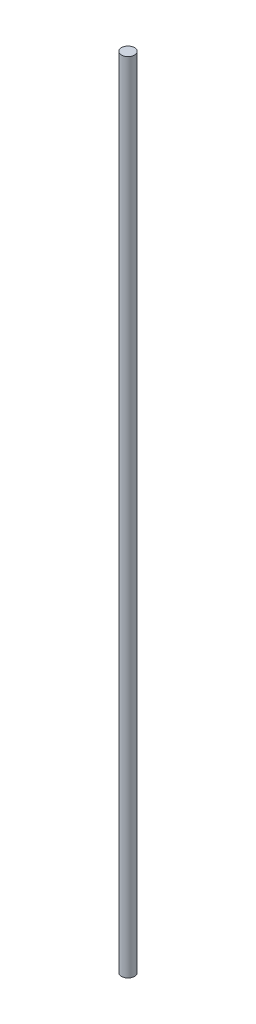
ISO-10303-21;
HEADER;
FILE_DESCRIPTION(('STEP AP214'),'2;1');
FILE_NAME('part.step','',(''),(''),'','','');
FILE_SCHEMA(('AUTOMOTIVE_DESIGN { 1 0 10303 214 1 1 1 1 }'));
ENDSEC;
DATA;
#1=APPLICATION_CONTEXT('core data for automotive mechanical design processes');
#2=APPLICATION_PROTOCOL_DEFINITION('international standard','automotive_design',2000,#1);
#3=PRODUCT_CONTEXT('',#1,'mechanical');
#4=PRODUCT('Part','Part','',(#3));
#5=PRODUCT_RELATED_PRODUCT_CATEGORY('part','',(#4));
#6=PRODUCT_DEFINITION_FORMATION('','',#4);
#7=PRODUCT_DEFINITION_CONTEXT('part definition',#1,'design');
#8=PRODUCT_DEFINITION('design','',#6,#7);
#9=PRODUCT_DEFINITION_SHAPE('','',#8);
#10=(LENGTH_UNIT() NAMED_UNIT(*) SI_UNIT(.MILLI.,.METRE.));
#11=(NAMED_UNIT(*) PLANE_ANGLE_UNIT() SI_UNIT($,.RADIAN.));
#12=(NAMED_UNIT(*) SI_UNIT($,.STERADIAN.) SOLID_ANGLE_UNIT());
#13=UNCERTAINTY_MEASURE_WITH_UNIT(LENGTH_MEASURE(1.E-05),#10,'distance_accuracy_value','');
#14=(GEOMETRIC_REPRESENTATION_CONTEXT(3) GLOBAL_UNCERTAINTY_ASSIGNED_CONTEXT((#13)) GLOBAL_UNIT_ASSIGNED_CONTEXT((#10,
#11,#12)) REPRESENTATION_CONTEXT('',''));
#15=CARTESIAN_POINT('',(0.,0.,0.));
#16=DIRECTION('',(0.,0.,1.));
#17=DIRECTION('',(1.,0.,0.));
#18=AXIS2_PLACEMENT_3D('',#15,#16,#17);
#19=CARTESIAN_POINT('',(0.,184.,0.));
#20=DIRECTION('',(0.,-1.,0.));
#21=DIRECTION('',(0.,0.,-1.));
#22=AXIS2_PLACEMENT_3D('',#19,#20,#21);
#23=CYLINDRICAL_SURFACE('',#22,3.);
#24=CARTESIAN_POINT('',(0.,184.,0.));
#25=DIRECTION('',(0.,1.,0.));
#26=DIRECTION('',(0.,0.,1.));
#27=AXIS2_PLACEMENT_3D('',#24,#25,#26);
#28=CIRCLE('',#27,3.);
#29=CARTESIAN_POINT('',(0.,184.,3.));
#30=VERTEX_POINT('',#29);
#31=EDGE_CURVE('E10',#30,#30,#28,.T.);
#32=ORIENTED_EDGE('',*,*,#31,.F.);
#33=EDGE_LOOP('',(#32));
#34=FACE_BOUND('',#33,.T.);
#35=CARTESIAN_POINT('',(0.,-184.,0.));
#36=DIRECTION('',(0.,1.,0.));
#37=DIRECTION('',(0.,0.,1.));
#38=AXIS2_PLACEMENT_3D('',#35,#36,#37);
#39=CIRCLE('',#38,3.);
#40=CARTESIAN_POINT('',(0.,-184.,3.));
#41=VERTEX_POINT('',#40);
#42=EDGE_CURVE('E37',#41,#41,#39,.T.);
#43=ORIENTED_EDGE('',*,*,#42,.T.);
#44=EDGE_LOOP('',(#43));
#45=FACE_BOUND('',#44,.T.);
#46=ADVANCED_FACE('F34',(#34,#45),#23,.T.);
#47=CARTESIAN_POINT('',(0.,184.,0.));
#48=DIRECTION('',(0.,1.,0.));
#49=DIRECTION('',(0.,0.,1.));
#50=AXIS2_PLACEMENT_3D('',#47,#48,#49);
#51=PLANE('',#50);
#52=ORIENTED_EDGE('',*,*,#31,.T.);
#53=EDGE_LOOP('',(#52));
#54=FACE_BOUND('',#53,.T.);
#55=ADVANCED_FACE('F49',(#54),#51,.T.);
#56=CARTESIAN_POINT('',(0.,-184.,0.));
#57=DIRECTION('',(0.,1.,0.));
#58=DIRECTION('',(0.,0.,1.));
#59=AXIS2_PLACEMENT_3D('',#56,#57,#58);
#60=PLANE('',#59);
#61=ORIENTED_EDGE('',*,*,#42,.F.);
#62=EDGE_LOOP('',(#61));
#63=FACE_BOUND('',#62,.T.);
#64=ADVANCED_FACE('F47',(#63),#60,.F.);
#65=CLOSED_SHELL('',(#46,#55,#64));
#66=MANIFOLD_SOLID_BREP('B2',#65);
#67=ADVANCED_BREP_SHAPE_REPRESENTATION('',(#18,#66),#14);
#68=SHAPE_DEFINITION_REPRESENTATION(#9,#67);
ENDSEC;
END-ISO-10303-21;
